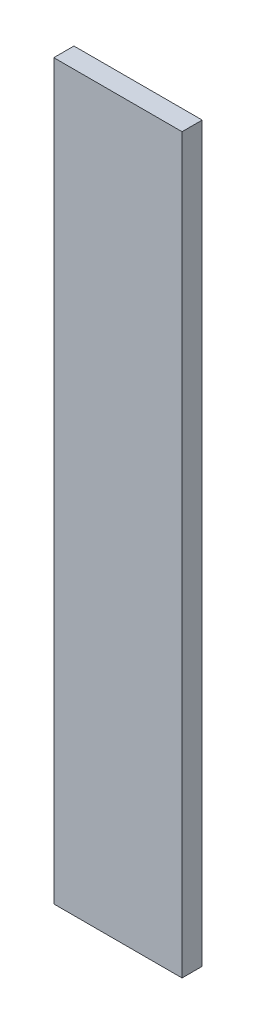
ISO-10303-21;
HEADER;
FILE_DESCRIPTION(('STEP AP214'),'2;1');
FILE_NAME('part.step','',(''),(''),'','','');
FILE_SCHEMA(('AUTOMOTIVE_DESIGN { 1 0 10303 214 1 1 1 1 }'));
ENDSEC;
DATA;
#1=APPLICATION_CONTEXT('core data for automotive mechanical design processes');
#2=APPLICATION_PROTOCOL_DEFINITION('international standard','automotive_design',2000,#1);
#3=PRODUCT_CONTEXT('',#1,'mechanical');
#4=PRODUCT('Part','Part','',(#3));
#5=PRODUCT_RELATED_PRODUCT_CATEGORY('part','',(#4));
#6=PRODUCT_DEFINITION_FORMATION('','',#4);
#7=PRODUCT_DEFINITION_CONTEXT('part definition',#1,'design');
#8=PRODUCT_DEFINITION('design','',#6,#7);
#9=PRODUCT_DEFINITION_SHAPE('','',#8);
#10=(LENGTH_UNIT() NAMED_UNIT(*) SI_UNIT(.MILLI.,.METRE.));
#11=(NAMED_UNIT(*) PLANE_ANGLE_UNIT() SI_UNIT($,.RADIAN.));
#12=(NAMED_UNIT(*) SI_UNIT($,.STERADIAN.) SOLID_ANGLE_UNIT());
#13=UNCERTAINTY_MEASURE_WITH_UNIT(LENGTH_MEASURE(1.E-05),#10,'distance_accuracy_value','');
#14=(GEOMETRIC_REPRESENTATION_CONTEXT(3) GLOBAL_UNCERTAINTY_ASSIGNED_CONTEXT((#13)) GLOBAL_UNIT_ASSIGNED_CONTEXT((#10,
#11,#12)) REPRESENTATION_CONTEXT('',''));
#15=CARTESIAN_POINT('',(0.,0.,0.));
#16=DIRECTION('',(0.,0.,1.));
#17=DIRECTION('',(1.,0.,0.));
#18=AXIS2_PLACEMENT_3D('',#15,#16,#17);
#19=CARTESIAN_POINT('',(-70.,400.,22.));
#20=DIRECTION('',(1.,0.,0.));
#21=DIRECTION('',(0.,0.,-1.));
#22=AXIS2_PLACEMENT_3D('',#19,#20,#21);
#23=PLANE('',#22);
#24=DIRECTION('',(0.,-1.,0.));
#25=VECTOR('',#24,1.);
#26=CARTESIAN_POINT('',(-70.,400.,0.));
#27=LINE('',#26,#25);
#28=CARTESIAN_POINT('',(-70.,400.,0.));
#29=VERTEX_POINT('',#28);
#30=CARTESIAN_POINT('',(-70.,-400.,0.));
#31=VERTEX_POINT('',#30);
#32=EDGE_CURVE('E82',#29,#31,#27,.T.);
#33=ORIENTED_EDGE('',*,*,#32,.T.);
#34=DIRECTION('',(0.,0.,-1.));
#35=VECTOR('',#34,1.);
#36=CARTESIAN_POINT('',(-70.,-400.,22.));
#37=LINE('',#36,#35);
#38=CARTESIAN_POINT('',(-70.,-400.,22.));
#39=VERTEX_POINT('',#38);
#40=EDGE_CURVE('E11',#39,#31,#37,.T.);
#41=ORIENTED_EDGE('',*,*,#40,.F.);
#42=DIRECTION('',(0.,-1.,0.));
#43=VECTOR('',#42,1.);
#44=CARTESIAN_POINT('',(-70.,400.,22.));
#45=LINE('',#44,#43);
#46=CARTESIAN_POINT('',(-70.,400.,22.));
#47=VERTEX_POINT('',#46);
#48=EDGE_CURVE('E68',#47,#39,#45,.T.);
#49=ORIENTED_EDGE('',*,*,#48,.F.);
#50=DIRECTION('',(0.,0.,-1.));
#51=VECTOR('',#50,1.);
#52=CARTESIAN_POINT('',(-70.,400.,22.));
#53=LINE('',#52,#51);
#54=EDGE_CURVE('E76',#47,#29,#53,.T.);
#55=ORIENTED_EDGE('',*,*,#54,.T.);
#56=EDGE_LOOP('',(#33,#41,#49,#55));
#57=FACE_BOUND('',#56,.T.);
#58=ADVANCED_FACE('F17',(#57),#23,.F.);
#59=CARTESIAN_POINT('',(-70.,-400.,22.));
#60=DIRECTION('',(0.,1.,0.));
#61=DIRECTION('',(0.,0.,1.));
#62=AXIS2_PLACEMENT_3D('',#59,#60,#61);
#63=PLANE('',#62);
#64=DIRECTION('',(1.,0.,0.));
#65=VECTOR('',#64,1.);
#66=CARTESIAN_POINT('',(-70.,-400.,0.));
#67=LINE('',#66,#65);
#68=CARTESIAN_POINT('',(70.,-400.,0.));
#69=VERTEX_POINT('',#68);
#70=EDGE_CURVE('E72',#31,#69,#67,.T.);
#71=ORIENTED_EDGE('',*,*,#70,.T.);
#72=DIRECTION('',(0.,0.,-1.));
#73=VECTOR('',#72,1.);
#74=CARTESIAN_POINT('',(70.,-400.,22.));
#75=LINE('',#74,#73);
#76=CARTESIAN_POINT('',(70.,-400.,22.));
#77=VERTEX_POINT('',#76);
#78=EDGE_CURVE('E25',#77,#69,#75,.T.);
#79=ORIENTED_EDGE('',*,*,#78,.F.);
#80=DIRECTION('',(1.,0.,0.));
#81=VECTOR('',#80,1.);
#82=CARTESIAN_POINT('',(-70.,-400.,22.));
#83=LINE('',#82,#81);
#84=EDGE_CURVE('E63',#39,#77,#83,.T.);
#85=ORIENTED_EDGE('',*,*,#84,.F.);
#86=ORIENTED_EDGE('',*,*,#40,.T.);
#87=EDGE_LOOP('',(#71,#79,#85,#86));
#88=FACE_BOUND('',#87,.T.);
#89=ADVANCED_FACE('F71',(#88),#63,.F.);
#90=CARTESIAN_POINT('',(70.,-400.,22.));
#91=DIRECTION('',(-1.,0.,0.));
#92=DIRECTION('',(0.,0.,1.));
#93=AXIS2_PLACEMENT_3D('',#90,#91,#92);
#94=PLANE('',#93);
#95=DIRECTION('',(0.,1.,0.));
#96=VECTOR('',#95,1.);
#97=CARTESIAN_POINT('',(70.,-400.,0.));
#98=LINE('',#97,#96);
#99=CARTESIAN_POINT('',(70.,400.,0.));
#100=VERTEX_POINT('',#99);
#101=EDGE_CURVE('E50',#69,#100,#98,.T.);
#102=ORIENTED_EDGE('',*,*,#101,.T.);
#103=DIRECTION('',(0.,0.,-1.));
#104=VECTOR('',#103,1.);
#105=CARTESIAN_POINT('',(70.,400.,22.));
#106=LINE('',#105,#104);
#107=CARTESIAN_POINT('',(70.,400.,22.));
#108=VERTEX_POINT('',#107);
#109=EDGE_CURVE('E73',#108,#100,#106,.T.);
#110=ORIENTED_EDGE('',*,*,#109,.F.);
#111=DIRECTION('',(0.,1.,0.));
#112=VECTOR('',#111,1.);
#113=CARTESIAN_POINT('',(70.,-400.,22.));
#114=LINE('',#113,#112);
#115=EDGE_CURVE('E66',#77,#108,#114,.T.);
#116=ORIENTED_EDGE('',*,*,#115,.F.);
#117=ORIENTED_EDGE('',*,*,#78,.T.);
#118=EDGE_LOOP('',(#102,#110,#116,#117));
#119=FACE_BOUND('',#118,.T.);
#120=ADVANCED_FACE('F74',(#119),#94,.F.);
#121=CARTESIAN_POINT('',(70.,400.,22.));
#122=DIRECTION('',(0.,-1.,0.));
#123=DIRECTION('',(0.,0.,-1.));
#124=AXIS2_PLACEMENT_3D('',#121,#122,#123);
#125=PLANE('',#124);
#126=DIRECTION('',(-1.,0.,0.));
#127=VECTOR('',#126,1.);
#128=CARTESIAN_POINT('',(70.,400.,0.));
#129=LINE('',#128,#127);
#130=EDGE_CURVE('E56',#100,#29,#129,.T.);
#131=ORIENTED_EDGE('',*,*,#130,.T.);
#132=ORIENTED_EDGE('',*,*,#54,.F.);
#133=DIRECTION('',(-1.,0.,0.));
#134=VECTOR('',#133,1.);
#135=CARTESIAN_POINT('',(70.,400.,22.));
#136=LINE('',#135,#134);
#137=EDGE_CURVE('E33',#108,#47,#136,.T.);
#138=ORIENTED_EDGE('',*,*,#137,.F.);
#139=ORIENTED_EDGE('',*,*,#109,.T.);
#140=EDGE_LOOP('',(#131,#132,#138,#139));
#141=FACE_BOUND('',#140,.T.);
#142=ADVANCED_FACE('F91',(#141),#125,.F.);
#143=CARTESIAN_POINT('',(-70.,-400.,22.));
#144=DIRECTION('',(0.,0.,1.));
#145=DIRECTION('',(1.,0.,0.));
#146=AXIS2_PLACEMENT_3D('',#143,#144,#145);
#147=PLANE('',#146);
#148=ORIENTED_EDGE('',*,*,#48,.T.);
#149=ORIENTED_EDGE('',*,*,#84,.T.);
#150=ORIENTED_EDGE('',*,*,#115,.T.);
#151=ORIENTED_EDGE('',*,*,#137,.T.);
#152=EDGE_LOOP('',(#148,#149,#150,#151));
#153=FACE_BOUND('',#152,.T.);
#154=ADVANCED_FACE('F64',(#153),#147,.T.);
#155=CARTESIAN_POINT('',(-70.,-400.,0.));
#156=DIRECTION('',(0.,0.,1.));
#157=DIRECTION('',(1.,0.,0.));
#158=AXIS2_PLACEMENT_3D('',#155,#156,#157);
#159=PLANE('',#158);
#160=ORIENTED_EDGE('',*,*,#32,.F.);
#161=ORIENTED_EDGE('',*,*,#130,.F.);
#162=ORIENTED_EDGE('',*,*,#101,.F.);
#163=ORIENTED_EDGE('',*,*,#70,.F.);
#164=EDGE_LOOP('',(#160,#161,#162,#163));
#165=FACE_BOUND('',#164,.T.);
#166=ADVANCED_FACE('F94',(#165),#159,.F.);
#167=CLOSED_SHELL('',(#58,#89,#120,#142,#154,#166));
#168=MANIFOLD_SOLID_BREP('B1',#167);
#169=ADVANCED_BREP_SHAPE_REPRESENTATION('',(#18,#168),#14);
#170=SHAPE_DEFINITION_REPRESENTATION(#9,#169);
ENDSEC;
END-ISO-10303-21;
